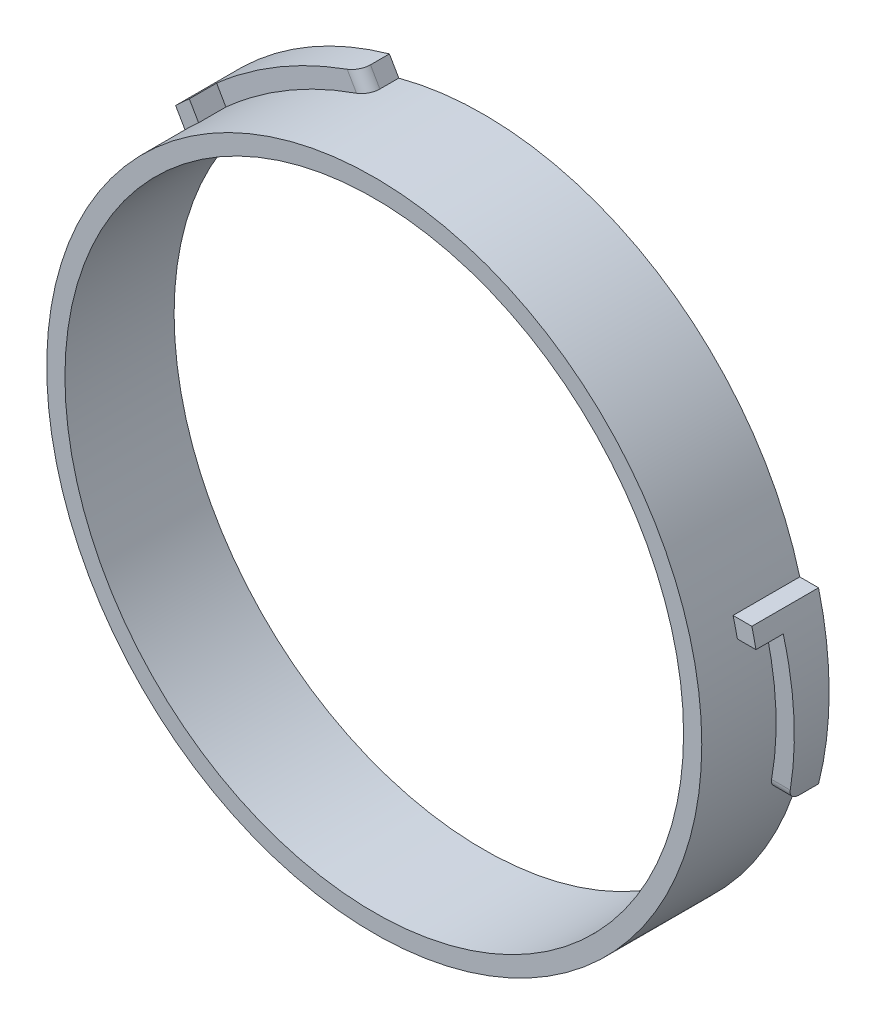
ISO-10303-21;
HEADER;
FILE_DESCRIPTION(('STEP AP214'),'2;1');
FILE_NAME('part.step','',(''),(''),'','','');
FILE_SCHEMA(('AUTOMOTIVE_DESIGN { 1 0 10303 214 1 1 1 1 }'));
ENDSEC;
DATA;
#1=APPLICATION_CONTEXT('core data for automotive mechanical design processes');
#2=APPLICATION_PROTOCOL_DEFINITION('international standard','automotive_design',2000,#1);
#3=PRODUCT_CONTEXT('',#1,'mechanical');
#4=PRODUCT('Part','Part','',(#3));
#5=PRODUCT_RELATED_PRODUCT_CATEGORY('part','',(#4));
#6=PRODUCT_DEFINITION_FORMATION('','',#4);
#7=PRODUCT_DEFINITION_CONTEXT('part definition',#1,'design');
#8=PRODUCT_DEFINITION('design','',#6,#7);
#9=PRODUCT_DEFINITION_SHAPE('','',#8);
#10=(LENGTH_UNIT() NAMED_UNIT(*) SI_UNIT(.MILLI.,.METRE.));
#11=(NAMED_UNIT(*) PLANE_ANGLE_UNIT() SI_UNIT($,.RADIAN.));
#12=(NAMED_UNIT(*) SI_UNIT($,.STERADIAN.) SOLID_ANGLE_UNIT());
#13=UNCERTAINTY_MEASURE_WITH_UNIT(LENGTH_MEASURE(1.E-05),#10,'distance_accuracy_value','');
#14=(GEOMETRIC_REPRESENTATION_CONTEXT(3) GLOBAL_UNCERTAINTY_ASSIGNED_CONTEXT((#13)) GLOBAL_UNIT_ASSIGNED_CONTEXT((#10,
#11,#12)) REPRESENTATION_CONTEXT('',''));
#15=CARTESIAN_POINT('',(0.,0.,0.));
#16=DIRECTION('',(0.,0.,1.));
#17=DIRECTION('',(1.,0.,0.));
#18=AXIS2_PLACEMENT_3D('',#15,#16,#17);
#19=CARTESIAN_POINT('',(0.,0.,-2.99999999999999));
#20=DIRECTION('',(0.,0.,-1.));
#21=DIRECTION('',(-1.,0.,0.));
#22=AXIS2_PLACEMENT_3D('',#19,#20,#21);
#23=CYLINDRICAL_SURFACE('',#22,54.);
#24=DIRECTION('',(0.,0.,-1.));
#25=VECTOR('',#24,1.);
#26=CARTESIAN_POINT('',(-38.2011652737924,38.1663591625452,-3.));
#27=LINE('',#26,#25);
#28=CARTESIAN_POINT('',(-38.2011652737924,38.1663591625452,-145.));
#29=VERTEX_POINT('',#28);
#30=CARTESIAN_POINT('',(-38.2011652737924,38.1663591625452,-134.));
#31=VERTEX_POINT('',#30);
#32=EDGE_CURVE('E300',#29,#31,#27,.F.);
#33=ORIENTED_EDGE('',*,*,#32,.F.);
#34=CARTESIAN_POINT('',(0.,0.,-145.));
#35=DIRECTION('',(0.,0.,-1.));
#36=DIRECTION('',(-1.,0.,0.));
#37=AXIS2_PLACEMENT_3D('',#34,#35,#36);
#38=CIRCLE('',#37,54.);
#39=CARTESIAN_POINT('',(-38.2011652737929,-38.1663591625447,-145.));
#40=VERTEX_POINT('',#39);
#41=EDGE_CURVE('E274',#40,#29,#38,.T.);
#42=ORIENTED_EDGE('',*,*,#41,.F.);
#43=DIRECTION('',(0.,0.,-1.));
#44=VECTOR('',#43,1.);
#45=CARTESIAN_POINT('',(-38.2011652737929,-38.1663591625447,-3.));
#46=LINE('',#45,#44);
#47=CARTESIAN_POINT('',(-38.2011652737929,-38.1663591625447,-141.883596765819));
#48=VERTEX_POINT('',#47);
#49=EDGE_CURVE('E326',#48,#40,#46,.T.);
#50=ORIENTED_EDGE('',*,*,#49,.F.);
#51=CARTESIAN_POINT('',(-38.2011652737929,-38.1663591625447,-141.883596765819));
#52=CARTESIAN_POINT('',(-38.2011654843626,-38.1663582502281,-141.828662060855));
#53=CARTESIAN_POINT('',(-38.1995078619468,-38.1680181617716,-141.773754247999));
#54=CARTESIAN_POINT('',(-38.1928982012159,-38.1746324071468,-141.664343674894));
#55=CARTESIAN_POINT('',(-38.1879465772808,-38.1795863265976,-141.609840864568));
#56=CARTESIAN_POINT('',(-38.1682167004249,-38.1993141444142,-141.447731525654));
#57=CARTESIAN_POINT('',(-38.1485631760464,-38.2189544278956,-141.341230667811));
#58=CARTESIAN_POINT('',(-38.0968662767875,-38.2704859384,-141.134439932355));
#59=CARTESIAN_POINT('',(-38.0648215775051,-38.3023784749744,-141.034150719988));
#60=CARTESIAN_POINT('',(-37.9893072352051,-38.3772765244489,-140.842403980467));
#61=CARTESIAN_POINT('',(-37.9458365186704,-38.4202830815465,-140.750947284266));
#62=CARTESIAN_POINT('',(-37.8479376851689,-38.5167287701726,-140.577834270253));
#63=CARTESIAN_POINT('',(-37.7933463926033,-38.5703228529595,-140.496356823663));
#64=CARTESIAN_POINT('',(-37.6751429348347,-38.685790941552,-140.346894771056));
#65=CARTESIAN_POINT('',(-37.6115273734064,-38.7476680641299,-140.278915268124));
#66=CARTESIAN_POINT('',(-37.4748157730335,-38.8799113213129,-140.156142920303));
#67=CARTESIAN_POINT('',(-37.4014826216113,-38.9504848036242,-140.101838038407));
#68=CARTESIAN_POINT('',(-37.2489769647152,-39.0963529517729,-140.010652502082));
#69=CARTESIAN_POINT('',(-37.1698084372799,-39.1716443961726,-139.973760102094));
#70=CARTESIAN_POINT('',(-37.0427795291311,-39.2916850726702,-139.930247501891));
#71=CARTESIAN_POINT('',(-36.9961549828254,-39.3355901823795,-139.917434127239));
#72=CARTESIAN_POINT('',(-36.9021673591179,-39.4237772286471,-139.897810259443));
#73=CARTESIAN_POINT('',(-36.8548057453011,-39.4680583545935,-139.890989113374));
#74=CARTESIAN_POINT('',(-36.8072120705265,-39.5123922282021,-139.887187074887));
#75=B_SPLINE_CURVE_WITH_KNOTS('',3,(#51,#52,#53,#54,#55,#56,#57,#58,#59,#60,#61,#62,#63,#64,#65,
#66,#67,#68,#69,#70,#71,#72,#73,#74),.UNSPECIFIED.,.F.,.F.,(4,2,2,2,2,2,2,2,2,2,2,4),(0.,
0.164700948774083,0.329381182352863,0.657872796503891,0.986399530428364,1.31495714171092,
1.64873685506212,1.98264251916463,2.32716416508593,2.67145308123226,2.86713731370389,
3.0624729525344),.UNSPECIFIED.);
#76=CARTESIAN_POINT('',(-36.8072120705265,-39.5123922282021,-139.887187074887));
#77=VERTEX_POINT('',#76);
#78=EDGE_CURVE('E394',#48,#77,#75,.T.);
#79=ORIENTED_EDGE('',*,*,#78,.T.);
#80=CARTESIAN_POINT('',(0.,0.,-139.16));
#81=DIRECTION('',(-0.0518682452612451,0.0299461453639736,0.998204845465779));
#82=DIRECTION('',(-0.864470754354082,0.499102422732892,-0.0598922907279468));
#83=AXIS2_PLACEMENT_3D('',#80,#81,#82);
#84=ELLIPSE('',#83,54.0971126771106,54.);
#85=CARTESIAN_POINT('',(-16.9076003341441,-51.2848228128055,-138.5));
#86=VERTEX_POINT('',#85);
#87=EDGE_CURVE('E323',#86,#77,#84,.F.);
#88=ORIENTED_EDGE('',*,*,#87,.F.);
#89=DIRECTION('',(0.,0.,-1.));
#90=VECTOR('',#89,1.);
#91=CARTESIAN_POINT('',(-16.9076003341441,-51.2848228128055,-2.99999999999999));
#92=LINE('',#91,#90);
#93=CARTESIAN_POINT('',(-16.907600334144,-51.2848228128055,-134.));
#94=VERTEX_POINT('',#93);
#95=EDGE_CURVE('E320',#94,#86,#92,.T.);
#96=ORIENTED_EDGE('',*,*,#95,.F.);
#97=CARTESIAN_POINT('',(0.,0.,-134.));
#98=DIRECTION('',(0.,0.,1.));
#99=DIRECTION('',(1.,0.,0.));
#100=AXIS2_PLACEMENT_3D('',#97,#98,#99);
#101=CIRCLE('',#100,54.);
#102=CARTESIAN_POINT('',(-13.9524539678287,-52.1663591625448,-134.));
#103=VERTEX_POINT('',#102);
#104=EDGE_CURVE('E306',#103,#94,#101,.F.);
#105=ORIENTED_EDGE('',*,*,#104,.F.);
#106=DIRECTION('',(0.,0.,-1.));
#107=VECTOR('',#106,1.);
#108=CARTESIAN_POINT('',(-13.9524539678287,-52.1663591625448,-3.));
#109=LINE('',#108,#107);
#110=CARTESIAN_POINT('',(-13.9524539678287,-52.1663591625448,-145.));
#111=VERTEX_POINT('',#110);
#112=EDGE_CURVE('E328',#111,#103,#109,.F.);
#113=ORIENTED_EDGE('',*,*,#112,.F.);
#114=CARTESIAN_POINT('',(52.1536192416212,-14.,-145.));
#115=VERTEX_POINT('',#114);
#116=EDGE_CURVE('E364',#115,#111,#38,.T.);
#117=ORIENTED_EDGE('',*,*,#116,.F.);
#118=DIRECTION('',(0.,0.,-1.));
#119=VECTOR('',#118,1.);
#120=CARTESIAN_POINT('',(52.1536192416212,-14.,-2.99999999999999));
#121=LINE('',#120,#119);
#122=CARTESIAN_POINT('',(52.1536192416212,-14.,-141.883596765819));
#123=VERTEX_POINT('',#122);
#124=EDGE_CURVE('E355',#123,#115,#121,.T.);
#125=ORIENTED_EDGE('',*,*,#124,.F.);
#126=CARTESIAN_POINT('',(52.1536192416212,-14.,-141.883596765819));
#127=CARTESIAN_POINT('',(52.1536185568167,-14.000000638517,-141.828662060855));
#128=CARTESIAN_POINT('',(52.1542272711735,-13.9977351396233,-141.773754247999));
#129=CARTESIAN_POINT('',(52.1566505453299,-13.9887038828323,-141.664343674894));
#130=CARTESIAN_POINT('',(52.158464953455,-13.9819386909891,-141.609840864568));
#131=CARTESIAN_POINT('',(52.1656848064175,-13.9549882075101,-141.447731525654));
#132=CARTESIAN_POINT('',(52.1728670286606,-13.9281476143837,-141.341230667811));
#133=CARTESIAN_POINT('',(52.1916461762234,-13.8576110310764,-141.134439932355));
#134=CARTESIAN_POINT('',(52.2032435734467,-13.813913239154,-141.034150719988));
#135=CARTESIAN_POINT('',(52.2303500158355,-13.7110668756349,-140.842403980467));
#136=CARTESIAN_POINT('',(52.245859428544,-13.6519168522463,-140.750947284266));
#137=CARTESIAN_POINT('',(52.2804344282289,-13.5189111311201,-140.577834270253));
#138=CARTESIAN_POINT('',(52.2995526191321,-13.4448366435394,-140.496356823663));
#139=CARTESIAN_POINT('',(52.3404491882954,-13.2847354020005,-140.346894771056));
#140=CARTESIAN_POINT('',(52.3622285676468,-13.1987041484386,-140.278915268124));
#141=CARTESIAN_POINT('',(52.40839878766,-13.0141868009322,-140.156142920303));
#142=CARTESIAN_POINT('',(52.4328506404641,-12.9153916877053,-140.101838038407));
#143=CARTESIAN_POINT('',(52.4829233339157,-12.710383840538,-140.010652502082));
#144=CARTESIAN_POINT('',(52.5085433737358,-12.6041761623991,-139.973760102094));
#145=CARTESIAN_POINT('',(52.5489871949959,-12.4341455626784,-139.930247501891));
#146=CARTESIAN_POINT('',(52.5636978622072,-12.371814966283,-139.917434127239));
#147=CARTESIAN_POINT('',(52.5930762727059,-12.2463257733772,-139.897810259443));
#148=CARTESIAN_POINT('',(52.6077440457752,-12.1831688496745,-139.890989113374));
#149=CARTESIAN_POINT('',(52.6223414691812,-12.1197845814559,-139.887187074887));
#150=B_SPLINE_CURVE_WITH_KNOTS('',3,(#126,#127,#128,#129,#130,#131,#132,#133,#134,#135,#136,
#137,#138,#139,#140,#141,#142,#143,#144,#145,#146,#147,#148,#149),.UNSPECIFIED.,.F.,.F.,(4,2,2,
2,2,2,2,2,2,2,2,4),(0.,0.164700948774083,0.329381182352863,0.65787279650389,0.986399530428337,
1.31495714171092,1.64873685506211,1.98264251916462,2.32716416508593,2.67145308123225,
2.8671373137039,3.0624729525344),.UNSPECIFIED.);
#151=CARTESIAN_POINT('',(52.6223414691812,-12.1197845814559,-139.887187074887));
#152=VERTEX_POINT('',#151);
#153=EDGE_CURVE('E372',#123,#152,#150,.T.);
#154=ORIENTED_EDGE('',*,*,#153,.T.);
#155=CARTESIAN_POINT('',(0.,0.,-139.16));
#156=DIRECTION('',(0.,-0.0598922907279468,0.998204845465779));
#157=DIRECTION('',(0.,-0.998204845465779,-0.0598922907279468));
#158=AXIS2_PLACEMENT_3D('',#155,#156,#157);
#159=ELLIPSE('',#158,54.0971126771106,54.);
#160=CARTESIAN_POINT('',(52.8677595515452,10.9999999999999,-138.5));
#161=VERTEX_POINT('',#160);
#162=EDGE_CURVE('E352',#161,#152,#159,.F.);
#163=ORIENTED_EDGE('',*,*,#162,.F.);
#164=DIRECTION('',(0.,0.,-1.));
#165=VECTOR('',#164,1.);
#166=CARTESIAN_POINT('',(52.8677595515452,10.9999999999999,-2.99999999999999));
#167=LINE('',#166,#165);
#168=CARTESIAN_POINT('',(52.8677595515452,11.,-134.));
#169=VERTEX_POINT('',#168);
#170=EDGE_CURVE('E349',#169,#161,#167,.T.);
#171=ORIENTED_EDGE('',*,*,#170,.F.);
#172=CARTESIAN_POINT('',(0.,0.,-134.));
#173=DIRECTION('',(0.,0.,1.));
#174=DIRECTION('',(1.,0.,0.));
#175=AXIS2_PLACEMENT_3D('',#172,#173,#174);
#176=CIRCLE('',#175,54.);
#177=CARTESIAN_POINT('',(52.1536192416212,14.,-134.));
#178=VERTEX_POINT('',#177);
#179=EDGE_CURVE('E335',#178,#169,#176,.F.);
#180=ORIENTED_EDGE('',*,*,#179,.F.);
#181=DIRECTION('',(0.,0.,-1.));
#182=VECTOR('',#181,1.);
#183=CARTESIAN_POINT('',(52.1536192416212,14.,-2.99999999999999));
#184=LINE('',#183,#182);
#185=CARTESIAN_POINT('',(52.1536192416212,14.,-145.));
#186=VERTEX_POINT('',#185);
#187=EDGE_CURVE('E357',#186,#178,#184,.F.);
#188=ORIENTED_EDGE('',*,*,#187,.F.);
#189=CARTESIAN_POINT('',(-13.952453967828,52.166359162545,-145.));
#190=VERTEX_POINT('',#189);
#191=EDGE_CURVE('E363',#190,#186,#38,.T.);
#192=ORIENTED_EDGE('',*,*,#191,.F.);
#193=DIRECTION('',(0.,0.,-1.));
#194=VECTOR('',#193,1.);
#195=CARTESIAN_POINT('',(-13.952453967828,52.166359162545,-3.));
#196=LINE('',#195,#194);
#197=CARTESIAN_POINT('',(-13.952453967828,52.166359162545,-141.883596765819));
#198=VERTEX_POINT('',#197);
#199=EDGE_CURVE('E298',#198,#190,#196,.T.);
#200=ORIENTED_EDGE('',*,*,#199,.F.);
#201=CARTESIAN_POINT('',(-13.952453967828,52.166359162545,-141.883596765819));
#202=CARTESIAN_POINT('',(-13.9524530724538,52.1663588887454,-141.828662060855));
#203=CARTESIAN_POINT('',(-13.9547194092264,52.1657533013952,-141.773754247999));
#204=CARTESIAN_POINT('',(-13.9637523441136,52.1633362899794,-141.664343674894));
#205=CARTESIAN_POINT('',(-13.9705183761738,52.161525017587,-141.609840864568));
#206=CARTESIAN_POINT('',(-13.9974681059922,52.1543023519246,-141.447731525654));
#207=CARTESIAN_POINT('',(-14.0243038526139,52.1471020422796,-141.341230667811));
#208=CARTESIAN_POINT('',(-14.0947798994356,52.1280969694767,-141.134439932355));
#209=CARTESIAN_POINT('',(-14.1384219959413,52.1162917141287,-141.034150719988));
#210=CARTESIAN_POINT('',(-14.2410427806301,52.0883434000841,-140.842403980467));
#211=CARTESIAN_POINT('',(-14.3000229098733,52.0721999337931,-140.750947284266));
#212=CARTESIAN_POINT('',(-14.4324967430597,52.035639901293,-140.577834270253));
#213=CARTESIAN_POINT('',(-14.5062062265285,52.0151594964993,-140.496356823663));
#214=CARTESIAN_POINT('',(-14.6653062534603,51.9705263435528,-140.346894771056));
#215=CARTESIAN_POINT('',(-14.75070119424,51.9463722125688,-140.278915268124));
#216=CARTESIAN_POINT('',(-14.9335830146261,51.8940981222453,-140.156142920303));
#217=CARTESIAN_POINT('',(-15.0313680188524,51.8658764913298,-140.101838038407));
#218=CARTESIAN_POINT('',(-15.2339463692003,51.8067367923112,-140.010652502082));
#219=CARTESIAN_POINT('',(-15.3387349364556,51.775820558572,-139.973760102094));
#220=CARTESIAN_POINT('',(-15.5062076658644,51.7258306353489,-139.930247501891));
#221=CARTESIAN_POINT('',(-15.5675428793815,51.7074051486629,-139.917434127239));
#222=CARTESIAN_POINT('',(-15.6909089135877,51.6701030020246,-139.897810259443));
#223=CARTESIAN_POINT('',(-15.7529383004738,51.6512272042683,-139.890989113374));
#224=CARTESIAN_POINT('',(-15.8151293986543,51.6321768096583,-139.887187074887));
#225=B_SPLINE_CURVE_WITH_KNOTS('',3,(#201,#202,#203,#204,#205,#206,#207,#208,#209,#210,#211,
#212,#213,#214,#215,#216,#217,#218,#219,#220,#221,#222,#223,#224),.UNSPECIFIED.,.F.,.F.,(4,2,2,
2,2,2,2,2,2,2,2,4),(0.,0.164700948774083,0.329381182352863,0.65787279650389,0.986399530428336,
1.31495714171092,1.64873685506211,1.98264251916463,2.32716416508593,2.67145308123225,
2.8671373137039,3.0624729525344),.UNSPECIFIED.);
#226=CARTESIAN_POINT('',(-15.8151293986544,51.6321768096583,-139.887187074887));
#227=VERTEX_POINT('',#226);
#228=EDGE_CURVE('E111',#198,#227,#225,.T.);
#229=ORIENTED_EDGE('',*,*,#228,.T.);
#230=CARTESIAN_POINT('',(0.,0.,-139.16));
#231=DIRECTION('',(0.0518682452612452,0.029946145363973,0.998204845465779));
#232=DIRECTION('',(0.864470754354088,0.499102422732882,-0.0598922907279467));
#233=AXIS2_PLACEMENT_3D('',#230,#231,#232);
#234=ELLIPSE('',#233,54.0971126771106,54.);
#235=CARTESIAN_POINT('',(-35.960159217401,40.2848228128059,-138.5));
#236=VERTEX_POINT('',#235);
#237=EDGE_CURVE('E295',#236,#227,#234,.F.);
#238=ORIENTED_EDGE('',*,*,#237,.F.);
#239=DIRECTION('',(0.,0.,-1.));
#240=VECTOR('',#239,1.);
#241=CARTESIAN_POINT('',(-35.960159217401,40.2848228128059,-2.99999999999999));
#242=LINE('',#241,#240);
#243=CARTESIAN_POINT('',(-35.9601592174011,40.2848228128059,-134.));
#244=VERTEX_POINT('',#243);
#245=EDGE_CURVE('E279',#244,#236,#242,.T.);
#246=ORIENTED_EDGE('',*,*,#245,.F.);
#247=CARTESIAN_POINT('',(0.,0.,-134.));
#248=DIRECTION('',(0.,0.,1.));
#249=DIRECTION('',(1.,0.,0.));
#250=AXIS2_PLACEMENT_3D('',#247,#248,#249);
#251=CIRCLE('',#250,54.);
#252=EDGE_CURVE('E275',#31,#244,#251,.F.);
#253=ORIENTED_EDGE('',*,*,#252,.F.);
#254=EDGE_LOOP('',(#33,#42,#50,#79,#88,#96,#105,#113,#117,#125,#154,#163,#171,#180,#188,#192,
#200,#229,#238,#246,#253));
#255=FACE_BOUND('',#254,.T.);
#256=CARTESIAN_POINT('',(0.,0.,-127.));
#257=DIRECTION('',(0.,0.,1.));
#258=DIRECTION('',(1.,0.,0.));
#259=AXIS2_PLACEMENT_3D('',#256,#257,#258);
#260=CIRCLE('',#259,54.);
#261=CARTESIAN_POINT('',(54.,0.,-127.));
#262=VERTEX_POINT('',#261);
#263=EDGE_CURVE('E561',#262,#262,#260,.F.);
#264=ORIENTED_EDGE('',*,*,#263,.T.);
#265=EDGE_LOOP('',(#264));
#266=FACE_BOUND('',#265,.T.);
#267=ADVANCED_FACE('F101',(#255,#266),#23,.T.);
#268=CARTESIAN_POINT('',(0.,0.,-2.99999999999999));
#269=DIRECTION('',(0.,0.,-1.));
#270=DIRECTION('',(-1.,0.,0.));
#271=AXIS2_PLACEMENT_3D('',#268,#269,#270);
#272=CYLINDRICAL_SURFACE('',#271,51.);
#273=CARTESIAN_POINT('',(0.,0.,-145.));
#274=DIRECTION('',(0.,0.,-1.));
#275=DIRECTION('',(-1.,0.,0.));
#276=AXIS2_PLACEMENT_3D('',#273,#274,#275);
#277=CIRCLE('',#276,51.);
#278=CARTESIAN_POINT('',(-51.,0.,-145.));
#279=VERTEX_POINT('',#278);
#280=EDGE_CURVE('E360',#279,#279,#277,.T.);
#281=ORIENTED_EDGE('',*,*,#280,.T.);
#282=EDGE_LOOP('',(#281));
#283=FACE_BOUND('',#282,.T.);
#284=CARTESIAN_POINT('',(0.,0.,-127.));
#285=DIRECTION('',(0.,0.,1.));
#286=DIRECTION('',(1.,0.,0.));
#287=AXIS2_PLACEMENT_3D('',#284,#285,#286);
#288=CIRCLE('',#287,51.);
#289=CARTESIAN_POINT('',(51.,0.,-127.));
#290=VERTEX_POINT('',#289);
#291=EDGE_CURVE('E106',#290,#290,#288,.T.);
#292=ORIENTED_EDGE('',*,*,#291,.T.);
#293=EDGE_LOOP('',(#292));
#294=FACE_BOUND('',#293,.T.);
#295=ADVANCED_FACE('F387',(#283,#294),#272,.F.);
#296=CARTESIAN_POINT('',(-54.,0.,-145.));
#297=DIRECTION('',(0.,0.,-1.));
#298=DIRECTION('',(-1.,0.,0.));
#299=AXIS2_PLACEMENT_3D('',#296,#297,#298);
#300=PLANE('',#299);
#301=ORIENTED_EDGE('',*,*,#280,.F.);
#302=EDGE_LOOP('',(#301));
#303=FACE_BOUND('',#302,.T.);
#304=DIRECTION('',(-0.499999999999992,0.866025403784443,0.));
#305=VECTOR('',#304,1.);
#306=CARTESIAN_POINT('',(-35.6243556529818,33.7031939778689,-145.));
#307=LINE('',#306,#305);
#308=CARTESIAN_POINT('',(-39.7513352200644,40.8513322698547,-145.));
#309=VERTEX_POINT('',#308);
#310=EDGE_CURVE('E264',#29,#309,#307,.T.);
#311=ORIENTED_EDGE('',*,*,#310,.T.);
#312=CARTESIAN_POINT('',(0.,0.,-145.));
#313=DIRECTION('',(0.,0.,-1.));
#314=DIRECTION('',(-1.,0.,0.));
#315=AXIS2_PLACEMENT_3D('',#312,#313,#314);
#316=CIRCLE('',#315,57.);
#317=CARTESIAN_POINT('',(-15.5026239141,54.8513322698545,-145.));
#318=VERTEX_POINT('',#317);
#319=EDGE_CURVE('E245',#309,#318,#316,.T.);
#320=ORIENTED_EDGE('',*,*,#319,.T.);
#321=DIRECTION('',(-0.499999999999992,0.866025403784443,0.));
#322=VECTOR('',#321,1.);
#323=CARTESIAN_POINT('',(-11.3756443470174,47.7031939778687,-145.));
#324=LINE('',#323,#322);
#325=EDGE_CURVE('E276',#190,#318,#324,.T.);
#326=ORIENTED_EDGE('',*,*,#325,.F.);
#327=ORIENTED_EDGE('',*,*,#191,.T.);
#328=DIRECTION('',(1.,0.,0.));
#329=VECTOR('',#328,1.);
#330=CARTESIAN_POINT('',(47.,14.,-145.));
#331=LINE('',#330,#329);
#332=CARTESIAN_POINT('',(55.2539591341652,14.,-145.));
#333=VERTEX_POINT('',#332);
#334=EDGE_CURVE('E332',#186,#333,#331,.T.);
#335=ORIENTED_EDGE('',*,*,#334,.T.);
#336=CARTESIAN_POINT('',(55.2539591341652,-14.,-145.));
#337=VERTEX_POINT('',#336);
#338=EDGE_CURVE('E256',#333,#337,#316,.T.);
#339=ORIENTED_EDGE('',*,*,#338,.T.);
#340=DIRECTION('',(1.,0.,0.));
#341=VECTOR('',#340,1.);
#342=CARTESIAN_POINT('',(47.,-14.,-145.));
#343=LINE('',#342,#341);
#344=EDGE_CURVE('E336',#115,#337,#343,.T.);
#345=ORIENTED_EDGE('',*,*,#344,.F.);
#346=ORIENTED_EDGE('',*,*,#116,.T.);
#347=DIRECTION('',(-0.500000000000004,-0.866025403784436,0.));
#348=VECTOR('',#347,1.);
#349=CARTESIAN_POINT('',(-11.3756443470181,-47.7031939778686,-145.));
#350=LINE('',#349,#348);
#351=CARTESIAN_POINT('',(-15.5026239141007,-54.8513322698542,-145.));
#352=VERTEX_POINT('',#351);
#353=EDGE_CURVE('E303',#111,#352,#350,.T.);
#354=ORIENTED_EDGE('',*,*,#353,.T.);
#355=CARTESIAN_POINT('',(-39.7513352200649,-40.8513322698541,-145.));
#356=VERTEX_POINT('',#355);
#357=EDGE_CURVE('E258',#352,#356,#316,.T.);
#358=ORIENTED_EDGE('',*,*,#357,.T.);
#359=DIRECTION('',(-0.500000000000004,-0.866025403784436,0.));
#360=VECTOR('',#359,1.);
#361=CARTESIAN_POINT('',(-35.6243556529823,-33.7031939778685,-145.));
#362=LINE('',#361,#360);
#363=EDGE_CURVE('E307',#40,#356,#362,.T.);
#364=ORIENTED_EDGE('',*,*,#363,.F.);
#365=ORIENTED_EDGE('',*,*,#41,.T.);
#366=EDGE_LOOP('',(#311,#320,#326,#327,#335,#339,#345,#346,#354,#358,#364,#365));
#367=FACE_BOUND('',#366,.T.);
#368=ADVANCED_FACE('F271',(#303,#367),#300,.T.);
#369=CARTESIAN_POINT('',(47.,14.,-134.));
#370=DIRECTION('',(0.,1.,0.));
#371=DIRECTION('',(0.,0.,1.));
#372=AXIS2_PLACEMENT_3D('',#369,#370,#371);
#373=PLANE('',#372);
#374=DIRECTION('',(1.,0.,0.));
#375=VECTOR('',#374,1.);
#376=CARTESIAN_POINT('',(47.,14.,-134.));
#377=LINE('',#376,#375);
#378=CARTESIAN_POINT('',(55.2539591341652,14.,-134.));
#379=VERTEX_POINT('',#378);
#380=EDGE_CURVE('E331',#178,#379,#377,.T.);
#381=ORIENTED_EDGE('',*,*,#380,.T.);
#382=DIRECTION('',(0.,0.,-1.));
#383=VECTOR('',#382,1.);
#384=CARTESIAN_POINT('',(55.2539591341652,14.,-130.));
#385=LINE('',#384,#383);
#386=EDGE_CURVE('E284',#379,#333,#385,.T.);
#387=ORIENTED_EDGE('',*,*,#386,.T.);
#388=ORIENTED_EDGE('',*,*,#334,.F.);
#389=ORIENTED_EDGE('',*,*,#187,.T.);
#390=EDGE_LOOP('',(#381,#387,#388,#389));
#391=FACE_BOUND('',#390,.T.);
#392=ADVANCED_FACE('F466',(#391),#373,.T.);
#393=CARTESIAN_POINT('',(47.,-14.,-145.));
#394=DIRECTION('',(0.,-1.,0.));
#395=DIRECTION('',(0.,0.,-1.));
#396=AXIS2_PLACEMENT_3D('',#393,#394,#395);
#397=PLANE('',#396);
#398=ORIENTED_EDGE('',*,*,#344,.T.);
#399=DIRECTION('',(0.,0.,-1.));
#400=VECTOR('',#399,1.);
#401=CARTESIAN_POINT('',(55.2539591341652,-14.,-130.));
#402=LINE('',#401,#400);
#403=CARTESIAN_POINT('',(55.2539591341652,-14.,-141.883596765819));
#404=VERTEX_POINT('',#403);
#405=EDGE_CURVE('E444',#337,#404,#402,.F.);
#406=ORIENTED_EDGE('',*,*,#405,.T.);
#407=DIRECTION('',(1.,0.,0.));
#408=VECTOR('',#407,1.);
#409=CARTESIAN_POINT('',(47.,-14.,-141.883596765819));
#410=LINE('',#409,#408);
#411=EDGE_CURVE('E370',#404,#123,#410,.F.);
#412=ORIENTED_EDGE('',*,*,#411,.T.);
#413=ORIENTED_EDGE('',*,*,#124,.T.);
#414=EDGE_LOOP('',(#398,#406,#412,#413));
#415=FACE_BOUND('',#414,.T.);
#416=ADVANCED_FACE('F536',(#415),#397,.T.);
#417=CARTESIAN_POINT('',(47.,-14.,-140.));
#418=DIRECTION('',(0.,-0.0598922907279468,0.998204845465779));
#419=DIRECTION('',(0.,-0.998204845465779,-0.0598922907279468));
#420=AXIS2_PLACEMENT_3D('',#417,#418,#419);
#421=PLANE('',#420);
#422=DIRECTION('',(1.,0.,0.));
#423=VECTOR('',#422,1.);
#424=CARTESIAN_POINT('',(47.,-12.1197845814559,-139.887187074887));
#425=LINE('',#424,#423);
#426=CARTESIAN_POINT('',(55.6965961410489,-12.1197845814559,-139.887187074887));
#427=VERTEX_POINT('',#426);
#428=EDGE_CURVE('E367',#152,#427,#425,.T.);
#429=ORIENTED_EDGE('',*,*,#428,.T.);
#430=CARTESIAN_POINT('',(0.,0.,-139.16));
#431=DIRECTION('',(0.,-0.0598922907279468,0.998204845465779));
#432=DIRECTION('',(0.,-0.998204845465779,-0.0598922907279468));
#433=AXIS2_PLACEMENT_3D('',#430,#431,#432);
#434=ELLIPSE('',#433,57.102507825839,57.);
#435=CARTESIAN_POINT('',(55.9285258164383,11.,-138.5));
#436=VERTEX_POINT('',#435);
#437=EDGE_CURVE('E118',#427,#436,#434,.T.);
#438=ORIENTED_EDGE('',*,*,#437,.T.);
#439=DIRECTION('',(1.,0.,0.));
#440=VECTOR('',#439,1.);
#441=CARTESIAN_POINT('',(47.,11.,-138.5));
#442=LINE('',#441,#440);
#443=EDGE_CURVE('E339',#161,#436,#442,.T.);
#444=ORIENTED_EDGE('',*,*,#443,.F.);
#445=ORIENTED_EDGE('',*,*,#162,.T.);
#446=EDGE_LOOP('',(#429,#438,#444,#445));
#447=FACE_BOUND('',#446,.T.);
#448=ADVANCED_FACE('F539',(#447),#421,.T.);
#449=CARTESIAN_POINT('',(47.,11.,-138.5));
#450=DIRECTION('',(0.,-1.,0.));
#451=DIRECTION('',(0.,0.,-1.));
#452=AXIS2_PLACEMENT_3D('',#449,#450,#451);
#453=PLANE('',#452);
#454=ORIENTED_EDGE('',*,*,#443,.T.);
#455=DIRECTION('',(0.,0.,-1.));
#456=VECTOR('',#455,1.);
#457=CARTESIAN_POINT('',(55.9285258164383,11.,-130.));
#458=LINE('',#457,#456);
#459=CARTESIAN_POINT('',(55.9285258164383,11.,-134.));
#460=VERTEX_POINT('',#459);
#461=EDGE_CURVE('E448',#436,#460,#458,.F.);
#462=ORIENTED_EDGE('',*,*,#461,.T.);
#463=DIRECTION('',(1.,0.,0.));
#464=VECTOR('',#463,1.);
#465=CARTESIAN_POINT('',(47.,11.,-134.));
#466=LINE('',#465,#464);
#467=EDGE_CURVE('E342',#169,#460,#466,.T.);
#468=ORIENTED_EDGE('',*,*,#467,.F.);
#469=ORIENTED_EDGE('',*,*,#170,.T.);
#470=EDGE_LOOP('',(#454,#462,#468,#469));
#471=FACE_BOUND('',#470,.T.);
#472=ADVANCED_FACE('F456',(#471),#453,.T.);
#473=CARTESIAN_POINT('',(47.,11.,-134.));
#474=DIRECTION('',(0.,0.,1.));
#475=DIRECTION('',(1.,0.,0.));
#476=AXIS2_PLACEMENT_3D('',#473,#474,#475);
#477=PLANE('',#476);
#478=ORIENTED_EDGE('',*,*,#467,.T.);
#479=CARTESIAN_POINT('',(0.,0.,-134.));
#480=DIRECTION('',(0.,0.,1.));
#481=DIRECTION('',(1.,0.,0.));
#482=AXIS2_PLACEMENT_3D('',#479,#480,#481);
#483=CIRCLE('',#482,57.);
#484=EDGE_CURVE('E451',#460,#379,#483,.T.);
#485=ORIENTED_EDGE('',*,*,#484,.T.);
#486=ORIENTED_EDGE('',*,*,#380,.F.);
#487=ORIENTED_EDGE('',*,*,#179,.T.);
#488=EDGE_LOOP('',(#478,#485,#486,#487));
#489=FACE_BOUND('',#488,.T.);
#490=ADVANCED_FACE('F459',(#489),#477,.T.);
#491=CARTESIAN_POINT('',(47.,-12.,-141.883596765819));
#492=DIRECTION('',(1.,0.,0.));
#493=DIRECTION('',(0.,0.,-1.));
#494=AXIS2_PLACEMENT_3D('',#491,#492,#493);
#495=CYLINDRICAL_SURFACE('',#494,2.);
#496=ORIENTED_EDGE('',*,*,#411,.F.);
#497=CARTESIAN_POINT('',(55.2539591341652,-14.,-141.883596765819));
#498=CARTESIAN_POINT('',(55.2539585125054,-14.0000005367194,-141.828523752097));
#499=CARTESIAN_POINT('',(55.2545359383956,-13.9977237283669,-141.773477634569));
#500=CARTESIAN_POINT('',(55.256834841071,-13.9886466767112,-141.663790158488));
#501=CARTESIAN_POINT('',(55.258556183353,-13.9818469652169,-141.609148753112));
#502=CARTESIAN_POINT('',(55.2654066347746,-13.9547553891467,-141.446613532741));
#503=CARTESIAN_POINT('',(55.2722223012515,-13.9277707139644,-141.339826121369));
#504=CARTESIAN_POINT('',(55.2900482512312,-13.8568352806215,-141.13247070724));
#505=CARTESIAN_POINT('',(55.3010591486179,-13.8128820394553,-141.0319036172));
#506=CARTESIAN_POINT('',(55.3268019748571,-13.7094060836742,-140.839640585733));
#507=CARTESIAN_POINT('',(55.3415341361408,-13.6498823965163,-140.74794519893));
#508=CARTESIAN_POINT('',(55.3743582345525,-13.5161106300099,-140.574562123407));
#509=CARTESIAN_POINT('',(55.3924951314453,-13.4416644849191,-140.493035984245));
#510=CARTESIAN_POINT('',(55.4312966401882,-13.2807451622867,-140.343545714561));
#511=CARTESIAN_POINT('',(55.4519621934757,-13.1942675036721,-140.275586660097));
#512=CARTESIAN_POINT('',(55.4957013876148,-13.0090901553543,-140.153160374182));
#513=CARTESIAN_POINT('',(55.518826869443,-12.9101124025027,-140.099132804047));
#514=CARTESIAN_POINT('',(55.5661779443691,-12.7047603394677,-140.008527143711));
#515=CARTESIAN_POINT('',(55.5904027393309,-12.5983913666549,-139.971936608825));
#516=CARTESIAN_POINT('',(55.6284079350701,-12.4291640094491,-139.929179878513));
#517=CARTESIAN_POINT('',(55.6420827192817,-12.3678057292128,-139.91671276943));
#518=CARTESIAN_POINT('',(55.6693916711392,-12.2442983859839,-139.897592125891));
#519=CARTESIAN_POINT('',(55.6830258677354,-12.1821509274881,-139.890928268508));
#520=CARTESIAN_POINT('',(55.6965961410489,-12.1197845814559,-139.887187074887));
#521=B_SPLINE_CURVE_WITH_KNOTS('',3,(#497,#498,#499,#500,#501,#502,#503,#504,#505,#506,#507,
#508,#509,#510,#511,#512,#513,#514,#515,#516,#517,#518,#519,#520),.UNSPECIFIED.,.F.,.F.,(4,2,2,
2,2,2,2,2,2,2,2,4),(0.,0.165115829650282,0.330212248197019,0.659568276928968,0.988972518515699,
1.3183973398773,1.65252481489193,1.98677706870723,2.33055444574179,2.67408610256854,
2.86610985522351,3.05779133078798),.UNSPECIFIED.);
#522=EDGE_CURVE('E437',#404,#427,#521,.T.);
#523=ORIENTED_EDGE('',*,*,#522,.T.);
#524=ORIENTED_EDGE('',*,*,#428,.F.);
#525=ORIENTED_EDGE('',*,*,#153,.F.);
#526=EDGE_LOOP('',(#496,#523,#524,#525));
#527=FACE_BOUND('',#526,.T.);
#528=ADVANCED_FACE('F382',(#527),#495,.T.);
#529=CARTESIAN_POINT('',(-11.3756443470181,-47.7031939778686,-134.));
#530=DIRECTION('',(0.866025403784436,-0.500000000000004,0.));
#531=DIRECTION('',(0.500000000000004,0.866025403784436,0.));
#532=AXIS2_PLACEMENT_3D('',#529,#530,#531);
#533=PLANE('',#532);
#534=DIRECTION('',(-0.500000000000004,-0.866025403784436,0.));
#535=VECTOR('',#534,1.);
#536=CARTESIAN_POINT('',(-11.3756443470181,-47.7031939778686,-134.));
#537=LINE('',#536,#535);
#538=CARTESIAN_POINT('',(-15.5026239141007,-54.8513322698542,-134.));
#539=VERTEX_POINT('',#538);
#540=EDGE_CURVE('E302',#103,#539,#537,.T.);
#541=ORIENTED_EDGE('',*,*,#540,.T.);
#542=DIRECTION('',(0.,0.,-1.));
#543=VECTOR('',#542,1.);
#544=CARTESIAN_POINT('',(-15.5026239141007,-54.8513322698542,-130.));
#545=LINE('',#544,#543);
#546=EDGE_CURVE('E445',#539,#352,#545,.T.);
#547=ORIENTED_EDGE('',*,*,#546,.T.);
#548=ORIENTED_EDGE('',*,*,#353,.F.);
#549=ORIENTED_EDGE('',*,*,#112,.T.);
#550=EDGE_LOOP('',(#541,#547,#548,#549));
#551=FACE_BOUND('',#550,.T.);
#552=ADVANCED_FACE('F516',(#551),#533,.T.);
#553=CARTESIAN_POINT('',(-35.6243556529823,-33.7031939778685,-145.));
#554=DIRECTION('',(-0.866025403784436,0.500000000000004,0.));
#555=DIRECTION('',(-0.500000000000004,-0.866025403784436,0.));
#556=AXIS2_PLACEMENT_3D('',#553,#554,#555);
#557=PLANE('',#556);
#558=ORIENTED_EDGE('',*,*,#363,.T.);
#559=DIRECTION('',(0.,0.,-1.));
#560=VECTOR('',#559,1.);
#561=CARTESIAN_POINT('',(-39.7513352200649,-40.8513322698541,-130.));
#562=LINE('',#561,#560);
#563=CARTESIAN_POINT('',(-39.7513352200649,-40.8513322698541,-141.883596765819));
#564=VERTEX_POINT('',#563);
#565=EDGE_CURVE('E418',#356,#564,#562,.F.);
#566=ORIENTED_EDGE('',*,*,#565,.T.);
#567=DIRECTION('',(-0.500000000000004,-0.866025403784436,0.));
#568=VECTOR('',#567,1.);
#569=CARTESIAN_POINT('',(-35.6243556529823,-33.7031939778685,-141.883596765819));
#570=LINE('',#569,#568);
#571=EDGE_CURVE('E401',#564,#48,#570,.F.);
#572=ORIENTED_EDGE('',*,*,#571,.T.);
#573=ORIENTED_EDGE('',*,*,#49,.T.);
#574=EDGE_LOOP('',(#558,#566,#572,#573));
#575=FACE_BOUND('',#574,.T.);
#576=ADVANCED_FACE('F498',(#575),#557,.T.);
#577=CARTESIAN_POINT('',(-35.6243556529823,-33.7031939778685,-140.));
#578=DIRECTION('',(-0.0518682452612451,0.0299461453639736,0.998204845465779));
#579=DIRECTION('',(0.998652727613559,0.,0.0518915179003178));
#580=AXIS2_PLACEMENT_3D('',#577,#578,#579);
#581=PLANE('',#580);
#582=DIRECTION('',(-0.500000000000004,-0.866025403784436,0.));
#583=VECTOR('',#582,1.);
#584=CARTESIAN_POINT('',(-33.9960413359359,-34.6433016871405,-139.887187074887));
#585=LINE('',#584,#583);
#586=CARTESIAN_POINT('',(-38.3443394064604,-42.1747748717426,-139.887187074887));
#587=VERTEX_POINT('',#586);
#588=EDGE_CURVE('E380',#77,#587,#585,.T.);
#589=ORIENTED_EDGE('',*,*,#588,.T.);
#590=CARTESIAN_POINT('',(0.,0.,-139.16));
#591=DIRECTION('',(-0.0518682452612451,0.0299461453639736,0.998204845465779));
#592=DIRECTION('',(-0.864470754354082,0.499102422732892,-0.0598922907279468));
#593=AXIS2_PLACEMENT_3D('',#590,#591,#592);
#594=ELLIPSE('',#593,57.102507825839,57.);
#595=CARTESIAN_POINT('',(-18.4379834665905,-53.9355241532492,-138.5));
#596=VERTEX_POINT('',#595);
#597=EDGE_CURVE('E126',#587,#596,#594,.T.);
#598=ORIENTED_EDGE('',*,*,#597,.T.);
#599=DIRECTION('',(-0.500000000000004,-0.866025403784436,0.));
#600=VECTOR('',#599,1.);
#601=CARTESIAN_POINT('',(-13.9737205583714,-46.2031939778686,-138.5));
#602=LINE('',#601,#600);
#603=EDGE_CURVE('E310',#86,#596,#602,.T.);
#604=ORIENTED_EDGE('',*,*,#603,.F.);
#605=ORIENTED_EDGE('',*,*,#87,.T.);
#606=EDGE_LOOP('',(#589,#598,#604,#605));
#607=FACE_BOUND('',#606,.T.);
#608=ADVANCED_FACE('F503',(#607),#581,.T.);
#609=CARTESIAN_POINT('',(-13.9737205583714,-46.2031939778686,-138.5));
#610=DIRECTION('',(-0.866025403784436,0.500000000000004,0.));
#611=DIRECTION('',(-0.500000000000004,-0.866025403784436,0.));
#612=AXIS2_PLACEMENT_3D('',#609,#610,#611);
#613=PLANE('',#612);
#614=ORIENTED_EDGE('',*,*,#603,.T.);
#615=DIRECTION('',(0.,0.,-1.));
#616=VECTOR('',#615,1.);
#617=CARTESIAN_POINT('',(-18.4379834665905,-53.9355241532492,-130.));
#618=LINE('',#617,#616);
#619=CARTESIAN_POINT('',(-18.4379834665905,-53.9355241532492,-134.));
#620=VERTEX_POINT('',#619);
#621=EDGE_CURVE('E510',#596,#620,#618,.F.);
#622=ORIENTED_EDGE('',*,*,#621,.T.);
#623=DIRECTION('',(-0.500000000000004,-0.866025403784436,0.));
#624=VECTOR('',#623,1.);
#625=CARTESIAN_POINT('',(-13.9737205583714,-46.2031939778686,-134.));
#626=LINE('',#625,#624);
#627=EDGE_CURVE('E313',#94,#620,#626,.T.);
#628=ORIENTED_EDGE('',*,*,#627,.F.);
#629=ORIENTED_EDGE('',*,*,#95,.T.);
#630=EDGE_LOOP('',(#614,#622,#628,#629));
#631=FACE_BOUND('',#630,.T.);
#632=ADVANCED_FACE('F523',(#631),#613,.T.);
#633=CARTESIAN_POINT('',(-13.9737205583714,-46.2031939778686,-134.));
#634=DIRECTION('',(0.,0.,1.));
#635=DIRECTION('',(1.,0.,0.));
#636=AXIS2_PLACEMENT_3D('',#633,#634,#635);
#637=PLANE('',#636);
#638=ORIENTED_EDGE('',*,*,#627,.T.);
#639=CARTESIAN_POINT('',(0.,0.,-134.));
#640=DIRECTION('',(0.,0.,1.));
#641=DIRECTION('',(1.,0.,0.));
#642=AXIS2_PLACEMENT_3D('',#639,#640,#641);
#643=CIRCLE('',#642,57.);
#644=EDGE_CURVE('E267',#620,#539,#643,.T.);
#645=ORIENTED_EDGE('',*,*,#644,.T.);
#646=ORIENTED_EDGE('',*,*,#540,.F.);
#647=ORIENTED_EDGE('',*,*,#104,.T.);
#648=EDGE_LOOP('',(#638,#645,#646,#647));
#649=FACE_BOUND('',#648,.T.);
#650=ADVANCED_FACE('F522',(#649),#637,.T.);
#651=CARTESIAN_POINT('',(-35.6243556529818,33.7031939778689,-134.));
#652=DIRECTION('',(-0.866025403784443,-0.499999999999992,0.));
#653=DIRECTION('',(0.499999999999992,-0.866025403784443,0.));
#654=AXIS2_PLACEMENT_3D('',#651,#652,#653);
#655=PLANE('',#654);
#656=DIRECTION('',(-0.499999999999992,0.866025403784443,0.));
#657=VECTOR('',#656,1.);
#658=CARTESIAN_POINT('',(-35.6243556529818,33.7031939778689,-134.));
#659=LINE('',#658,#657);
#660=CARTESIAN_POINT('',(-39.7513352200644,40.8513322698547,-134.));
#661=VERTEX_POINT('',#660);
#662=EDGE_CURVE('E266',#31,#661,#659,.T.);
#663=ORIENTED_EDGE('',*,*,#662,.T.);
#664=DIRECTION('',(0.,0.,-1.));
#665=VECTOR('',#664,1.);
#666=CARTESIAN_POINT('',(-39.7513352200644,40.8513322698547,-130.));
#667=LINE('',#666,#665);
#668=EDGE_CURVE('E248',#661,#309,#667,.T.);
#669=ORIENTED_EDGE('',*,*,#668,.T.);
#670=ORIENTED_EDGE('',*,*,#310,.F.);
#671=ORIENTED_EDGE('',*,*,#32,.T.);
#672=EDGE_LOOP('',(#663,#669,#670,#671));
#673=FACE_BOUND('',#672,.T.);
#674=ADVANCED_FACE('F262',(#673),#655,.T.);
#675=CARTESIAN_POINT('',(-11.3756443470174,47.7031939778687,-145.));
#676=DIRECTION('',(0.866025403784443,0.499999999999992,0.));
#677=DIRECTION('',(-0.499999999999992,0.866025403784443,0.));
#678=AXIS2_PLACEMENT_3D('',#675,#676,#677);
#679=PLANE('',#678);
#680=ORIENTED_EDGE('',*,*,#325,.T.);
#681=DIRECTION('',(0.,0.,-1.));
#682=VECTOR('',#681,1.);
#683=CARTESIAN_POINT('',(-15.5026239141,54.8513322698544,-130.));
#684=LINE('',#683,#682);
#685=CARTESIAN_POINT('',(-15.5026239141,54.8513322698545,-141.883596765819));
#686=VERTEX_POINT('',#685);
#687=EDGE_CURVE('E251',#318,#686,#684,.F.);
#688=ORIENTED_EDGE('',*,*,#687,.T.);
#689=DIRECTION('',(-0.499999999999992,0.866025403784443,0.));
#690=VECTOR('',#689,1.);
#691=CARTESIAN_POINT('',(-11.3756443470174,47.7031939778687,-141.883596765819));
#692=LINE('',#691,#690);
#693=EDGE_CURVE('E476',#686,#198,#692,.F.);
#694=ORIENTED_EDGE('',*,*,#693,.T.);
#695=ORIENTED_EDGE('',*,*,#199,.T.);
#696=EDGE_LOOP('',(#680,#688,#694,#695));
#697=FACE_BOUND('',#696,.T.);
#698=ADVANCED_FACE('F428',(#697),#679,.T.);
#699=CARTESIAN_POINT('',(-11.3756443470174,47.7031939778687,-140.));
#700=DIRECTION('',(0.0518682452612452,0.029946145363973,0.998204845465779));
#701=DIRECTION('',(0.998652727613559,0.,-0.051891517900318));
#702=AXIS2_PLACEMENT_3D('',#699,#700,#701);
#703=PLANE('',#702);
#704=DIRECTION('',(-0.499999999999992,0.866025403784443,0.));
#705=VECTOR('',#704,1.);
#706=CARTESIAN_POINT('',(-13.0039586640638,46.7630862685967,-139.887187074887));
#707=LINE('',#706,#705);
#708=CARTESIAN_POINT('',(-17.3522567345882,54.2945594531988,-139.887187074887));
#709=VERTEX_POINT('',#708);
#710=EDGE_CURVE('E400',#227,#709,#707,.T.);
#711=ORIENTED_EDGE('',*,*,#710,.T.);
#712=CARTESIAN_POINT('',(0.,0.,-139.16));
#713=DIRECTION('',(0.0518682452612452,0.029946145363973,0.998204845465779));
#714=DIRECTION('',(0.864470754354088,0.499102422732882,-0.0598922907279467));
#715=AXIS2_PLACEMENT_3D('',#712,#713,#714);
#716=ELLIPSE('',#715,57.102507825839,57.);
#717=CARTESIAN_POINT('',(-37.4905423498475,42.9355241532497,-138.5));
#718=VERTEX_POINT('',#717);
#719=EDGE_CURVE('E268',#709,#718,#716,.T.);
#720=ORIENTED_EDGE('',*,*,#719,.T.);
#721=DIRECTION('',(-0.499999999999992,0.866025403784443,0.));
#722=VECTOR('',#721,1.);
#723=CARTESIAN_POINT('',(-33.0262794416285,35.2031939778689,-138.5));
#724=LINE('',#723,#722);
#725=EDGE_CURVE('E281',#236,#718,#724,.T.);
#726=ORIENTED_EDGE('',*,*,#725,.F.);
#727=ORIENTED_EDGE('',*,*,#237,.T.);
#728=EDGE_LOOP('',(#711,#720,#726,#727));
#729=FACE_BOUND('',#728,.T.);
#730=ADVANCED_FACE('F484',(#729),#703,.T.);
#731=CARTESIAN_POINT('',(-33.0262794416285,35.2031939778689,-138.5));
#732=DIRECTION('',(0.866025403784443,0.499999999999992,0.));
#733=DIRECTION('',(-0.499999999999992,0.866025403784443,0.));
#734=AXIS2_PLACEMENT_3D('',#731,#732,#733);
#735=PLANE('',#734);
#736=ORIENTED_EDGE('',*,*,#725,.T.);
#737=DIRECTION('',(0.,0.,-1.));
#738=VECTOR('',#737,1.);
#739=CARTESIAN_POINT('',(-37.4905423498475,42.9355241532497,-130.));
#740=LINE('',#739,#738);
#741=CARTESIAN_POINT('',(-37.4905423498475,42.9355241532497,-134.));
#742=VERTEX_POINT('',#741);
#743=EDGE_CURVE('E490',#718,#742,#740,.F.);
#744=ORIENTED_EDGE('',*,*,#743,.T.);
#745=DIRECTION('',(-0.499999999999992,0.866025403784443,0.));
#746=VECTOR('',#745,1.);
#747=CARTESIAN_POINT('',(-33.0262794416285,35.2031939778689,-134.));
#748=LINE('',#747,#746);
#749=EDGE_CURVE('E289',#244,#742,#748,.T.);
#750=ORIENTED_EDGE('',*,*,#749,.F.);
#751=ORIENTED_EDGE('',*,*,#245,.T.);
#752=EDGE_LOOP('',(#736,#744,#750,#751));
#753=FACE_BOUND('',#752,.T.);
#754=ADVANCED_FACE('F488',(#753),#735,.T.);
#755=CARTESIAN_POINT('',(-33.0262794416285,35.2031939778689,-134.));
#756=DIRECTION('',(0.,0.,1.));
#757=DIRECTION('',(1.,0.,0.));
#758=AXIS2_PLACEMENT_3D('',#755,#756,#757);
#759=PLANE('',#758);
#760=ORIENTED_EDGE('',*,*,#749,.T.);
#761=CARTESIAN_POINT('',(0.,0.,-134.));
#762=DIRECTION('',(0.,0.,1.));
#763=DIRECTION('',(1.,0.,0.));
#764=AXIS2_PLACEMENT_3D('',#761,#762,#763);
#765=CIRCLE('',#764,57.);
#766=EDGE_CURVE('E492',#742,#661,#765,.T.);
#767=ORIENTED_EDGE('',*,*,#766,.T.);
#768=ORIENTED_EDGE('',*,*,#662,.F.);
#769=ORIENTED_EDGE('',*,*,#252,.T.);
#770=EDGE_LOOP('',(#760,#767,#768,#769));
#771=FACE_BOUND('',#770,.T.);
#772=ADVANCED_FACE('F406',(#771),#759,.T.);
#773=CARTESIAN_POINT('',(-33.8923048454134,-34.7031939778685,-141.883596765819));
#774=DIRECTION('',(-0.500000000000004,-0.866025403784436,0.));
#775=DIRECTION('',(0.866025403784436,-0.500000000000004,0.));
#776=AXIS2_PLACEMENT_3D('',#773,#774,#775);
#777=CYLINDRICAL_SURFACE('',#776,2.);
#778=ORIENTED_EDGE('',*,*,#571,.F.);
#779=CARTESIAN_POINT('',(-39.7513352200649,-40.8513322698541,-141.883596765819));
#780=CARTESIAN_POINT('',(-39.7513353740477,-40.8513314631212,-141.828523752097));
#781=CARTESIAN_POINT('',(-39.7496523131199,-40.8529699327872,-141.773477634569));
#782=CARTESIAN_POINT('',(-39.7429408071323,-40.8594993667327,-141.663790158488));
#783=CARTESIAN_POINT('',(-39.7379127553809,-40.8643899486247,-141.609148753112));
#784=CARTESIAN_POINT('',(-39.7178759879863,-40.8838684016183,-141.446613532741));
#785=CARTESIAN_POINT('',(-39.697914407004,-40.9032632795222,-141.339826121369));
#786=CARTESIAN_POINT('',(-39.6453954946904,-40.9541687217227,-141.13247070724));
#787=CARTESIAN_POINT('',(-39.6128363199552,-40.9856810591611,-141.0319036172));
#788=CARTESIAN_POINT('',(-39.5360949266875,-41.05971297854,-140.839640585733));
#789=CARTESIAN_POINT('',(-39.4919119821237,-41.1022332480433,-140.74794519893));
#790=CARTESIAN_POINT('',(-39.3924742832259,-41.1975456343773,-140.574562123407));
#791=CARTESIAN_POINT('',(-39.3370704788098,-41.2504757203778,-140.493035984245));
#792=CARTESIAN_POINT('',(-39.2171110118218,-41.3645384739705,-140.343545714561));
#793=CARTESIAN_POINT('',(-39.1525519392455,-41.425674197408,-140.275586660097));
#794=CARTESIAN_POINT('',(-39.0140532484664,-41.5561421248324,-140.153160374182));
#795=CARTESIAN_POINT('',(-38.9398987410016,-41.6256582559962,-140.099132804047));
#796=CARTESIAN_POINT('',(-38.7857341751568,-41.7693415212962,-140.008527143711));
#797=CARTESIAN_POINT('',(-38.7057283400074,-41.843505295541,-139.971936608825));
#798=CARTESIAN_POINT('',(-38.5781757475214,-41.9610324391298,-139.929179878513));
#799=CARTESIAN_POINT('',(-38.53187531021,-42.0035542897665,-139.91671276943));
#800=CARTESIAN_POINT('',(-38.4385692893486,-42.0889582074403,-139.897592125891));
#801=CARTESIAN_POINT('',(-38.3915651098087,-42.1318394973006,-139.890928268508));
#802=CARTESIAN_POINT('',(-38.3443394064604,-42.1747748717426,-139.887187074887));
#803=B_SPLINE_CURVE_WITH_KNOTS('',3,(#779,#780,#781,#782,#783,#784,#785,#786,#787,#788,#789,
#790,#791,#792,#793,#794,#795,#796,#797,#798,#799,#800,#801,#802),.UNSPECIFIED.,.F.,.F.,(4,2,2,
2,2,2,2,2,2,2,2,4),(0.,0.165115829650282,0.330212248197019,0.659568276928968,0.988972518515697,
1.3183973398773,1.65252481489193,1.98677706870723,2.33055444574179,2.67408610256854,
2.86610985522352,3.05779133078798),.UNSPECIFIED.);
#804=EDGE_CURVE('E410',#564,#587,#803,.T.);
#805=ORIENTED_EDGE('',*,*,#804,.T.);
#806=ORIENTED_EDGE('',*,*,#588,.F.);
#807=ORIENTED_EDGE('',*,*,#78,.F.);
#808=EDGE_LOOP('',(#778,#805,#806,#807));
#809=FACE_BOUND('',#808,.T.);
#810=ADVANCED_FACE('F403',(#809),#777,.T.);
#811=CARTESIAN_POINT('',(-13.1076951545863,46.7031939778687,-141.883596765819));
#812=DIRECTION('',(-0.499999999999992,0.866025403784443,0.));
#813=DIRECTION('',(-0.866025403784443,-0.499999999999992,0.));
#814=AXIS2_PLACEMENT_3D('',#811,#812,#813);
#815=CYLINDRICAL_SURFACE('',#814,2.);
#816=ORIENTED_EDGE('',*,*,#693,.F.);
#817=CARTESIAN_POINT('',(-15.5026239141,54.8513322698545,-141.883596765819));
#818=CARTESIAN_POINT('',(-15.5026231384574,54.8513319998409,-141.828523752097));
#819=CARTESIAN_POINT('',(-15.5048836252753,54.8506936611544,-141.773477634569));
#820=CARTESIAN_POINT('',(-15.5138940339383,54.8481460434443,-141.663790158488));
#821=CARTESIAN_POINT('',(-15.5206434279717,54.8462369138419,-141.609148753112));
#822=CARTESIAN_POINT('',(-15.5475306467879,54.8386237907654,-141.446613532741));
#823=CARTESIAN_POINT('',(-15.5743078942471,54.8310339934869,-141.339826121369));
#824=CARTESIAN_POINT('',(-15.6446527565404,54.8110040023445,-141.13247070724));
#825=CARTESIAN_POINT('',(-15.6882228286623,54.7985630986167,-141.0319036172));
#826=CARTESIAN_POINT('',(-15.7907070481693,54.7691190622145,-140.839640585733));
#827=CARTESIAN_POINT('',(-15.8496221540167,54.75211564456,-140.74794519893));
#828=CARTESIAN_POINT('',(-15.9818839513262,54.7136562643876,-140.574562123407));
#829=CARTESIAN_POINT('',(-16.0554246526352,54.6921402052971,-140.493035984245));
#830=CARTESIAN_POINT('',(-16.214185628366,54.6452836362575,-140.343545714561));
#831=CARTESIAN_POINT('',(-16.2994102542298,54.6199417010804,-140.275586660097));
#832=CARTESIAN_POINT('',(-16.481648139148,54.565232280187,-140.153160374182));
#833=CARTESIAN_POINT('',(-16.5789281284411,54.5357706584992,-140.099132804047));
#834=CARTESIAN_POINT('',(-16.780443769212,54.4741018607642,-140.008527143711));
#835=CARTESIAN_POINT('',(-16.8846743993232,54.4418966621963,-139.971936608825));
#836=CARTESIAN_POINT('',(-17.0502321875484,54.3901964485793,-139.929179878513));
#837=CARTESIAN_POINT('',(-17.1102074090714,54.3713600189796,-139.91671276943));
#838=CARTESIAN_POINT('',(-17.2308223817903,54.3332565934245,-139.897592125891));
#839=CARTESIAN_POINT('',(-17.2914607579263,54.3139904247891,-139.890928268508));
#840=CARTESIAN_POINT('',(-17.3522567345882,54.2945594531988,-139.887187074887));
#841=B_SPLINE_CURVE_WITH_KNOTS('',3,(#817,#818,#819,#820,#821,#822,#823,#824,#825,#826,#827,
#828,#829,#830,#831,#832,#833,#834,#835,#836,#837,#838,#839,#840),.UNSPECIFIED.,.F.,.F.,(4,2,2,
2,2,2,2,2,2,2,2,4),(0.,0.165115829650282,0.330212248197019,0.659568276928969,0.988972518515669,
1.3183973398773,1.65252481489193,1.98677706870723,2.33055444574179,2.67408610256854,
2.86610985522351,3.05779133078797),.UNSPECIFIED.);
#842=EDGE_CURVE('E12',#686,#709,#841,.T.);
#843=ORIENTED_EDGE('',*,*,#842,.T.);
#844=ORIENTED_EDGE('',*,*,#710,.F.);
#845=ORIENTED_EDGE('',*,*,#228,.F.);
#846=EDGE_LOOP('',(#816,#843,#844,#845));
#847=FACE_BOUND('',#846,.T.);
#848=ADVANCED_FACE('F103',(#847),#815,.T.);
#849=CARTESIAN_POINT('',(0.,0.,-130.));
#850=DIRECTION('',(0.,0.,-1.));
#851=DIRECTION('',(-1.,0.,0.));
#852=AXIS2_PLACEMENT_3D('',#849,#850,#851);
#853=CYLINDRICAL_SURFACE('',#852,57.);
#854=ORIENTED_EDGE('',*,*,#766,.F.);
#855=ORIENTED_EDGE('',*,*,#743,.F.);
#856=ORIENTED_EDGE('',*,*,#719,.F.);
#857=ORIENTED_EDGE('',*,*,#842,.F.);
#858=ORIENTED_EDGE('',*,*,#687,.F.);
#859=ORIENTED_EDGE('',*,*,#319,.F.);
#860=ORIENTED_EDGE('',*,*,#668,.F.);
#861=EDGE_LOOP('',(#854,#855,#856,#857,#858,#859,#860));
#862=FACE_BOUND('',#861,.T.);
#863=ADVANCED_FACE('F247',(#862),#853,.T.);
#864=ORIENTED_EDGE('',*,*,#644,.F.);
#865=ORIENTED_EDGE('',*,*,#621,.F.);
#866=ORIENTED_EDGE('',*,*,#597,.F.);
#867=ORIENTED_EDGE('',*,*,#804,.F.);
#868=ORIENTED_EDGE('',*,*,#565,.F.);
#869=ORIENTED_EDGE('',*,*,#357,.F.);
#870=ORIENTED_EDGE('',*,*,#546,.F.);
#871=EDGE_LOOP('',(#864,#865,#866,#867,#868,#869,#870));
#872=FACE_BOUND('',#871,.T.);
#873=ADVANCED_FACE('F427',(#872),#853,.T.);
#874=ORIENTED_EDGE('',*,*,#484,.F.);
#875=ORIENTED_EDGE('',*,*,#461,.F.);
#876=ORIENTED_EDGE('',*,*,#437,.F.);
#877=ORIENTED_EDGE('',*,*,#522,.F.);
#878=ORIENTED_EDGE('',*,*,#405,.F.);
#879=ORIENTED_EDGE('',*,*,#338,.F.);
#880=ORIENTED_EDGE('',*,*,#386,.F.);
#881=EDGE_LOOP('',(#874,#875,#876,#877,#878,#879,#880));
#882=FACE_BOUND('',#881,.T.);
#883=ADVANCED_FACE('F421',(#882),#853,.T.);
#884=CARTESIAN_POINT('',(0.,0.,-127.));
#885=DIRECTION('',(0.,0.,1.));
#886=DIRECTION('',(1.,0.,0.));
#887=AXIS2_PLACEMENT_3D('',#884,#885,#886);
#888=PLANE('',#887);
#889=ORIENTED_EDGE('',*,*,#263,.F.);
#890=EDGE_LOOP('',(#889));
#891=FACE_BOUND('',#890,.T.);
#892=ORIENTED_EDGE('',*,*,#291,.F.);
#893=EDGE_LOOP('',(#892));
#894=FACE_BOUND('',#893,.T.);
#895=ADVANCED_FACE('F426',(#891,#894),#888,.T.);
#896=CLOSED_SHELL('',(#267,#295,#368,#392,#416,#448,#472,#490,#528,#552,#576,#608,#632,#650,
#674,#698,#730,#754,#772,#810,#848,#863,#873,#883,#895));
#897=MANIFOLD_SOLID_BREP('B2',#896);
#898=ADVANCED_BREP_SHAPE_REPRESENTATION('',(#18,#897),#14);
#899=SHAPE_DEFINITION_REPRESENTATION(#9,#898);
ENDSEC;
END-ISO-10303-21;
